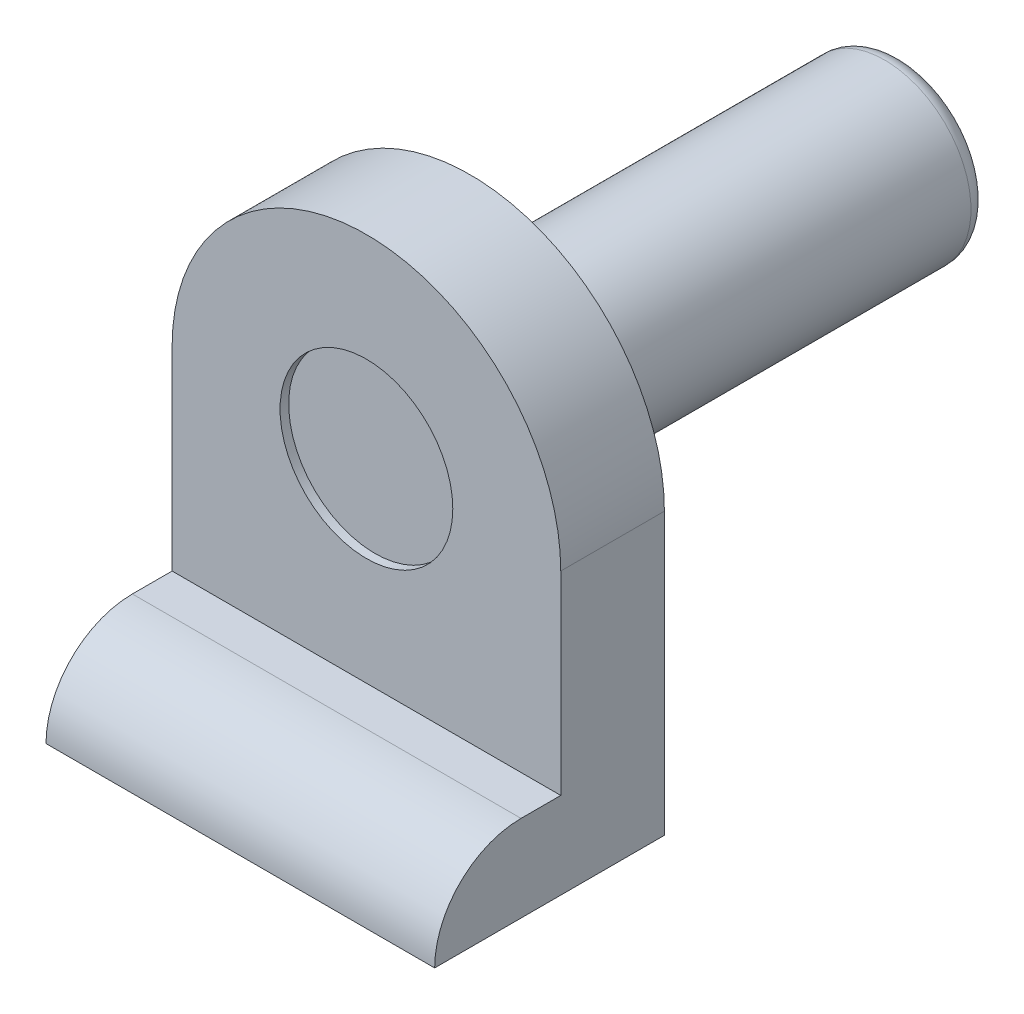
ISO-10303-21;
HEADER;
FILE_DESCRIPTION(('STEP AP214'),'2;1');
FILE_NAME('part.step','',(''),(''),'','','');
FILE_SCHEMA(('AUTOMOTIVE_DESIGN { 1 0 10303 214 1 1 1 1 }'));
ENDSEC;
DATA;
#1=APPLICATION_CONTEXT('core data for automotive mechanical design processes');
#2=APPLICATION_PROTOCOL_DEFINITION('international standard','automotive_design',2000,#1);
#3=PRODUCT_CONTEXT('',#1,'mechanical');
#4=PRODUCT('Part','Part','',(#3));
#5=PRODUCT_RELATED_PRODUCT_CATEGORY('part','',(#4));
#6=PRODUCT_DEFINITION_FORMATION('','',#4);
#7=PRODUCT_DEFINITION_CONTEXT('part definition',#1,'design');
#8=PRODUCT_DEFINITION('design','',#6,#7);
#9=PRODUCT_DEFINITION_SHAPE('','',#8);
#10=(LENGTH_UNIT() NAMED_UNIT(*) SI_UNIT(.MILLI.,.METRE.));
#11=(NAMED_UNIT(*) PLANE_ANGLE_UNIT() SI_UNIT($,.RADIAN.));
#12=(NAMED_UNIT(*) SI_UNIT($,.STERADIAN.) SOLID_ANGLE_UNIT());
#13=UNCERTAINTY_MEASURE_WITH_UNIT(LENGTH_MEASURE(1.E-05),#10,'distance_accuracy_value','');
#14=(GEOMETRIC_REPRESENTATION_CONTEXT(3) GLOBAL_UNCERTAINTY_ASSIGNED_CONTEXT((#13)) GLOBAL_UNIT_ASSIGNED_CONTEXT((#10,
#11,#12)) REPRESENTATION_CONTEXT('',''));
#15=CARTESIAN_POINT('',(0.,0.,0.));
#16=DIRECTION('',(0.,0.,1.));
#17=DIRECTION('',(1.,0.,0.));
#18=AXIS2_PLACEMENT_3D('',#15,#16,#17);
#19=CARTESIAN_POINT('',(0.,0.,1.2));
#20=DIRECTION('',(0.,0.,-1.));
#21=DIRECTION('',(-1.,0.,0.));
#22=AXIS2_PLACEMENT_3D('',#19,#20,#21);
#23=CYLINDRICAL_SURFACE('',#22,2.25);
#24=CARTESIAN_POINT('',(0.,0.,0.));
#25=DIRECTION('',(0.,0.,1.));
#26=DIRECTION('',(1.,0.,0.));
#27=AXIS2_PLACEMENT_3D('',#24,#25,#26);
#28=CIRCLE('',#27,2.25);
#29=CARTESIAN_POINT('',(-2.25,0.,0.));
#30=VERTEX_POINT('',#29);
#31=CARTESIAN_POINT('',(2.25,0.,0.));
#32=VERTEX_POINT('',#31);
#33=EDGE_CURVE('E136',#30,#32,#28,.F.);
#34=ORIENTED_EDGE('',*,*,#33,.F.);
#35=DIRECTION('',(0.,0.,-1.));
#36=VECTOR('',#35,1.);
#37=CARTESIAN_POINT('',(-2.25,0.,1.2));
#38=LINE('',#37,#36);
#39=CARTESIAN_POINT('',(-2.25,0.,1.2));
#40=VERTEX_POINT('',#39);
#41=EDGE_CURVE('E102',#40,#30,#38,.T.);
#42=ORIENTED_EDGE('',*,*,#41,.F.);
#43=CARTESIAN_POINT('',(0.,0.,1.2));
#44=DIRECTION('',(0.,0.,1.));
#45=DIRECTION('',(1.,0.,0.));
#46=AXIS2_PLACEMENT_3D('',#43,#44,#45);
#47=CIRCLE('',#46,2.25);
#48=CARTESIAN_POINT('',(2.25,0.,1.2));
#49=VERTEX_POINT('',#48);
#50=EDGE_CURVE('E137',#40,#49,#47,.F.);
#51=ORIENTED_EDGE('',*,*,#50,.T.);
#52=DIRECTION('',(0.,0.,-1.));
#53=VECTOR('',#52,1.);
#54=CARTESIAN_POINT('',(2.25,0.,1.2));
#55=LINE('',#54,#53);
#56=EDGE_CURVE('E154',#49,#32,#55,.T.);
#57=ORIENTED_EDGE('',*,*,#56,.T.);
#58=EDGE_LOOP('',(#34,#42,#51,#57));
#59=FACE_BOUND('',#58,.T.);
#60=ADVANCED_FACE('F44',(#59),#23,.T.);
#61=CARTESIAN_POINT('',(-2.25,0.,1.2));
#62=DIRECTION('',(1.,0.,0.));
#63=DIRECTION('',(0.,1.,0.));
#64=AXIS2_PLACEMENT_3D('',#61,#62,#63);
#65=PLANE('',#64);
#66=DIRECTION('',(0.,0.,-1.));
#67=VECTOR('',#66,1.);
#68=CARTESIAN_POINT('',(-2.25,-3.25,2.66));
#69=LINE('',#68,#67);
#70=CARTESIAN_POINT('',(-2.25,-3.25,2.66));
#71=VERTEX_POINT('',#70);
#72=CARTESIAN_POINT('',(-2.25,-3.25,0.));
#73=VERTEX_POINT('',#72);
#74=EDGE_CURVE('E105',#71,#73,#69,.T.);
#75=ORIENTED_EDGE('',*,*,#74,.F.);
#76=CARTESIAN_POINT('',(-2.25,-3.25,1.66));
#77=DIRECTION('',(1.,0.,0.));
#78=DIRECTION('',(0.,1.,0.));
#79=AXIS2_PLACEMENT_3D('',#76,#77,#78);
#80=CIRCLE('',#79,1.);
#81=CARTESIAN_POINT('',(-2.25,-2.25,1.66));
#82=VERTEX_POINT('',#81);
#83=EDGE_CURVE('E68',#71,#82,#80,.F.);
#84=ORIENTED_EDGE('',*,*,#83,.T.);
#85=DIRECTION('',(0.,0.,-1.));
#86=VECTOR('',#85,1.);
#87=CARTESIAN_POINT('',(-2.25,-2.25,2.66));
#88=LINE('',#87,#86);
#89=CARTESIAN_POINT('',(-2.25,-2.25,1.2));
#90=VERTEX_POINT('',#89);
#91=EDGE_CURVE('E113',#82,#90,#88,.T.);
#92=ORIENTED_EDGE('',*,*,#91,.T.);
#93=DIRECTION('',(0.,-1.,0.));
#94=VECTOR('',#93,1.);
#95=CARTESIAN_POINT('',(-2.25,0.,1.2));
#96=LINE('',#95,#94);
#97=EDGE_CURVE('E141',#40,#90,#96,.T.);
#98=ORIENTED_EDGE('',*,*,#97,.F.);
#99=ORIENTED_EDGE('',*,*,#41,.T.);
#100=DIRECTION('',(0.,-1.,0.));
#101=VECTOR('',#100,1.);
#102=CARTESIAN_POINT('',(-2.25,0.,0.));
#103=LINE('',#102,#101);
#104=EDGE_CURVE('E108',#30,#73,#103,.T.);
#105=ORIENTED_EDGE('',*,*,#104,.T.);
#106=EDGE_LOOP('',(#75,#84,#92,#98,#99,#105));
#107=FACE_BOUND('',#106,.T.);
#108=ADVANCED_FACE('F106',(#107),#65,.F.);
#109=CARTESIAN_POINT('',(2.25,0.,1.2));
#110=DIRECTION('',(1.,0.,0.));
#111=DIRECTION('',(0.,1.,0.));
#112=AXIS2_PLACEMENT_3D('',#109,#110,#111);
#113=PLANE('',#112);
#114=DIRECTION('',(0.,0.,-1.));
#115=VECTOR('',#114,1.);
#116=CARTESIAN_POINT('',(2.25,-2.25,2.66));
#117=LINE('',#116,#115);
#118=CARTESIAN_POINT('',(2.25,-2.25,1.66));
#119=VERTEX_POINT('',#118);
#120=CARTESIAN_POINT('',(2.25,-2.25,1.2));
#121=VERTEX_POINT('',#120);
#122=EDGE_CURVE('E120',#119,#121,#117,.T.);
#123=ORIENTED_EDGE('',*,*,#122,.F.);
#124=CARTESIAN_POINT('',(2.25,-3.25,1.66));
#125=DIRECTION('',(1.,0.,0.));
#126=DIRECTION('',(0.,1.,0.));
#127=AXIS2_PLACEMENT_3D('',#124,#125,#126);
#128=CIRCLE('',#127,1.);
#129=CARTESIAN_POINT('',(2.25,-3.25,2.66));
#130=VERTEX_POINT('',#129);
#131=EDGE_CURVE('E168',#119,#130,#128,.T.);
#132=ORIENTED_EDGE('',*,*,#131,.T.);
#133=DIRECTION('',(0.,0.,-1.));
#134=VECTOR('',#133,1.);
#135=CARTESIAN_POINT('',(2.25,-3.25,2.66));
#136=LINE('',#135,#134);
#137=CARTESIAN_POINT('',(2.25,-3.25,0.));
#138=VERTEX_POINT('',#137);
#139=EDGE_CURVE('E114',#130,#138,#136,.T.);
#140=ORIENTED_EDGE('',*,*,#139,.T.);
#141=DIRECTION('',(0.,-1.,0.));
#142=VECTOR('',#141,1.);
#143=CARTESIAN_POINT('',(2.25,0.,0.));
#144=LINE('',#143,#142);
#145=EDGE_CURVE('E142',#32,#138,#144,.T.);
#146=ORIENTED_EDGE('',*,*,#145,.F.);
#147=ORIENTED_EDGE('',*,*,#56,.F.);
#148=DIRECTION('',(0.,-1.,0.));
#149=VECTOR('',#148,1.);
#150=CARTESIAN_POINT('',(2.25,0.,1.2));
#151=LINE('',#150,#149);
#152=EDGE_CURVE('E150',#49,#121,#151,.T.);
#153=ORIENTED_EDGE('',*,*,#152,.T.);
#154=EDGE_LOOP('',(#123,#132,#140,#146,#147,#153));
#155=FACE_BOUND('',#154,.T.);
#156=ADVANCED_FACE('F194',(#155),#113,.T.);
#157=CARTESIAN_POINT('',(0.,0.,1.2));
#158=DIRECTION('',(0.,0.,1.));
#159=DIRECTION('',(1.,0.,0.));
#160=AXIS2_PLACEMENT_3D('',#157,#158,#159);
#161=PLANE('',#160);
#162=CARTESIAN_POINT('',(0.,0.,1.2));
#163=DIRECTION('',(0.,0.,1.));
#164=DIRECTION('',(1.,0.,0.));
#165=AXIS2_PLACEMENT_3D('',#162,#163,#164);
#166=CIRCLE('',#165,1.);
#167=CARTESIAN_POINT('',(1.,0.,1.2));
#168=VERTEX_POINT('',#167);
#169=EDGE_CURVE('E129',#168,#168,#166,.T.);
#170=ORIENTED_EDGE('',*,*,#169,.F.);
#171=EDGE_LOOP('',(#170));
#172=FACE_BOUND('',#171,.T.);
#173=ORIENTED_EDGE('',*,*,#50,.F.);
#174=ORIENTED_EDGE('',*,*,#97,.T.);
#175=DIRECTION('',(1.,0.,0.));
#176=VECTOR('',#175,1.);
#177=CARTESIAN_POINT('',(0.,-2.25,1.2));
#178=LINE('',#177,#176);
#179=EDGE_CURVE('E146',#90,#121,#178,.T.);
#180=ORIENTED_EDGE('',*,*,#179,.T.);
#181=ORIENTED_EDGE('',*,*,#152,.F.);
#182=EDGE_LOOP('',(#173,#174,#180,#181));
#183=FACE_BOUND('',#182,.T.);
#184=ADVANCED_FACE('F190',(#172,#183),#161,.T.);
#185=CARTESIAN_POINT('',(0.,0.,0.));
#186=DIRECTION('',(0.,0.,1.));
#187=DIRECTION('',(1.,0.,0.));
#188=AXIS2_PLACEMENT_3D('',#185,#186,#187);
#189=PLANE('',#188);
#190=CARTESIAN_POINT('',(0.,0.,0.));
#191=DIRECTION('',(0.,0.,-1.));
#192=DIRECTION('',(-1.,0.,0.));
#193=AXIS2_PLACEMENT_3D('',#190,#191,#192);
#194=CIRCLE('',#193,1.);
#195=CARTESIAN_POINT('',(-1.,0.,0.));
#196=VERTEX_POINT('',#195);
#197=EDGE_CURVE('E170',#196,#196,#194,.T.);
#198=ORIENTED_EDGE('',*,*,#197,.F.);
#199=EDGE_LOOP('',(#198));
#200=FACE_BOUND('',#199,.T.);
#201=ORIENTED_EDGE('',*,*,#33,.T.);
#202=ORIENTED_EDGE('',*,*,#145,.T.);
#203=DIRECTION('',(1.,0.,0.));
#204=VECTOR('',#203,1.);
#205=CARTESIAN_POINT('',(2.25,-3.25,0.));
#206=LINE('',#205,#204);
#207=EDGE_CURVE('E121',#73,#138,#206,.T.);
#208=ORIENTED_EDGE('',*,*,#207,.F.);
#209=ORIENTED_EDGE('',*,*,#104,.F.);
#210=EDGE_LOOP('',(#201,#202,#208,#209));
#211=FACE_BOUND('',#210,.T.);
#212=ADVANCED_FACE('F193',(#200,#211),#189,.F.);
#213=CARTESIAN_POINT('',(-2.25,-2.25,2.66));
#214=DIRECTION('',(0.,-1.,0.));
#215=DIRECTION('',(0.,0.,-1.));
#216=AXIS2_PLACEMENT_3D('',#213,#214,#215);
#217=PLANE('',#216);
#218=ORIENTED_EDGE('',*,*,#91,.F.);
#219=DIRECTION('',(-1.,0.,0.));
#220=VECTOR('',#219,1.);
#221=CARTESIAN_POINT('',(-2.25,-2.25,1.66));
#222=LINE('',#221,#220);
#223=EDGE_CURVE('E60',#82,#119,#222,.F.);
#224=ORIENTED_EDGE('',*,*,#223,.T.);
#225=ORIENTED_EDGE('',*,*,#122,.T.);
#226=ORIENTED_EDGE('',*,*,#179,.F.);
#227=EDGE_LOOP('',(#218,#224,#225,#226));
#228=FACE_BOUND('',#227,.T.);
#229=ADVANCED_FACE('F202',(#228),#217,.F.);
#230=CARTESIAN_POINT('',(2.25,-3.25,2.66));
#231=DIRECTION('',(0.,1.,0.));
#232=DIRECTION('',(0.,0.,1.));
#233=AXIS2_PLACEMENT_3D('',#230,#231,#232);
#234=PLANE('',#233);
#235=ORIENTED_EDGE('',*,*,#207,.T.);
#236=ORIENTED_EDGE('',*,*,#139,.F.);
#237=DIRECTION('',(1.,0.,0.));
#238=VECTOR('',#237,1.);
#239=CARTESIAN_POINT('',(2.25,-3.25,2.66));
#240=LINE('',#239,#238);
#241=EDGE_CURVE('E100',#71,#130,#240,.T.);
#242=ORIENTED_EDGE('',*,*,#241,.F.);
#243=ORIENTED_EDGE('',*,*,#74,.T.);
#244=EDGE_LOOP('',(#235,#236,#242,#243));
#245=FACE_BOUND('',#244,.T.);
#246=ADVANCED_FACE('F117',(#245),#234,.F.);
#247=CARTESIAN_POINT('',(0.,-3.25,1.66));
#248=DIRECTION('',(-1.,0.,0.));
#249=DIRECTION('',(0.,0.,1.));
#250=AXIS2_PLACEMENT_3D('',#247,#248,#249);
#251=CYLINDRICAL_SURFACE('',#250,1.);
#252=ORIENTED_EDGE('',*,*,#131,.F.);
#253=ORIENTED_EDGE('',*,*,#223,.F.);
#254=ORIENTED_EDGE('',*,*,#83,.F.);
#255=ORIENTED_EDGE('',*,*,#241,.T.);
#256=EDGE_LOOP('',(#252,#253,#254,#255));
#257=FACE_BOUND('',#256,.T.);
#258=ADVANCED_FACE('F98',(#257),#251,.T.);
#259=CARTESIAN_POINT('',(0.,0.,1.1));
#260=DIRECTION('',(0.,0.,1.));
#261=DIRECTION('',(1.,0.,0.));
#262=AXIS2_PLACEMENT_3D('',#259,#260,#261);
#263=CYLINDRICAL_SURFACE('',#262,1.);
#264=CARTESIAN_POINT('',(0.,0.,1.1));
#265=DIRECTION('',(0.,0.,1.));
#266=DIRECTION('',(1.,0.,0.));
#267=AXIS2_PLACEMENT_3D('',#264,#265,#266);
#268=CIRCLE('',#267,1.);
#269=CARTESIAN_POINT('',(1.,0.,1.1));
#270=VERTEX_POINT('',#269);
#271=EDGE_CURVE('E126',#270,#270,#268,.T.);
#272=ORIENTED_EDGE('',*,*,#271,.F.);
#273=EDGE_LOOP('',(#272));
#274=FACE_BOUND('',#273,.T.);
#275=ORIENTED_EDGE('',*,*,#169,.T.);
#276=EDGE_LOOP('',(#275));
#277=FACE_BOUND('',#276,.T.);
#278=ADVANCED_FACE('F188',(#274,#277),#263,.F.);
#279=CARTESIAN_POINT('',(0.,0.,1.1));
#280=DIRECTION('',(0.,0.,1.));
#281=DIRECTION('',(1.,0.,0.));
#282=AXIS2_PLACEMENT_3D('',#279,#280,#281);
#283=PLANE('',#282);
#284=ORIENTED_EDGE('',*,*,#271,.T.);
#285=EDGE_LOOP('',(#284));
#286=FACE_BOUND('',#285,.T.);
#287=ADVANCED_FACE('F225',(#286),#283,.T.);
#288=CARTESIAN_POINT('',(0.,0.,-5.));
#289=DIRECTION('',(0.,0.,1.));
#290=DIRECTION('',(1.,0.,0.));
#291=AXIS2_PLACEMENT_3D('',#288,#289,#290);
#292=CYLINDRICAL_SURFACE('',#291,1.);
#293=CARTESIAN_POINT('',(0.,0.,-4.8));
#294=DIRECTION('',(0.,0.,-1.));
#295=DIRECTION('',(-1.,0.,0.));
#296=AXIS2_PLACEMENT_3D('',#293,#294,#295);
#297=CIRCLE('',#296,1.);
#298=CARTESIAN_POINT('',(-1.,0.,-4.8));
#299=VERTEX_POINT('',#298);
#300=EDGE_CURVE('E11',#299,#299,#297,.F.);
#301=ORIENTED_EDGE('',*,*,#300,.T.);
#302=EDGE_LOOP('',(#301));
#303=FACE_BOUND('',#302,.T.);
#304=ORIENTED_EDGE('',*,*,#197,.T.);
#305=EDGE_LOOP('',(#304));
#306=FACE_BOUND('',#305,.T.);
#307=ADVANCED_FACE('F234',(#303,#306),#292,.T.);
#308=CARTESIAN_POINT('',(0.,0.,-5.));
#309=DIRECTION('',(0.,0.,-1.));
#310=DIRECTION('',(-1.,0.,0.));
#311=AXIS2_PLACEMENT_3D('',#308,#309,#310);
#312=PLANE('',#311);
#313=CARTESIAN_POINT('',(0.,0.,-5.));
#314=DIRECTION('',(0.,0.,-1.));
#315=DIRECTION('',(-1.,0.,0.));
#316=AXIS2_PLACEMENT_3D('',#313,#314,#315);
#317=CIRCLE('',#316,0.8);
#318=CARTESIAN_POINT('',(-0.8,0.,-5.));
#319=VERTEX_POINT('',#318);
#320=EDGE_CURVE('E53',#319,#319,#317,.T.);
#321=ORIENTED_EDGE('',*,*,#320,.T.);
#322=EDGE_LOOP('',(#321));
#323=FACE_BOUND('',#322,.T.);
#324=ADVANCED_FACE('F237',(#323),#312,.T.);
#325=CARTESIAN_POINT('',(0.,0.,-4.8));
#326=DIRECTION('',(0.,0.,-1.));
#327=DIRECTION('',(-1.,0.,0.));
#328=AXIS2_PLACEMENT_3D('',#325,#326,#327);
#329=TOROIDAL_SURFACE('',#328,0.8,0.2);
#330=ORIENTED_EDGE('',*,*,#300,.F.);
#331=EDGE_LOOP('',(#330));
#332=FACE_BOUND('',#331,.T.);
#333=ORIENTED_EDGE('',*,*,#320,.F.);
#334=EDGE_LOOP('',(#333));
#335=FACE_BOUND('',#334,.T.);
#336=ADVANCED_FACE('F46',(#332,#335),#329,.T.);
#337=CLOSED_SHELL('',(#60,#108,#156,#184,#212,#229,#246,#258,#278,#287,#307,#324,#336));
#338=MANIFOLD_SOLID_BREP('B2',#337);
#339=ADVANCED_BREP_SHAPE_REPRESENTATION('',(#18,#338),#14);
#340=SHAPE_DEFINITION_REPRESENTATION(#9,#339);
ENDSEC;
END-ISO-10303-21;
